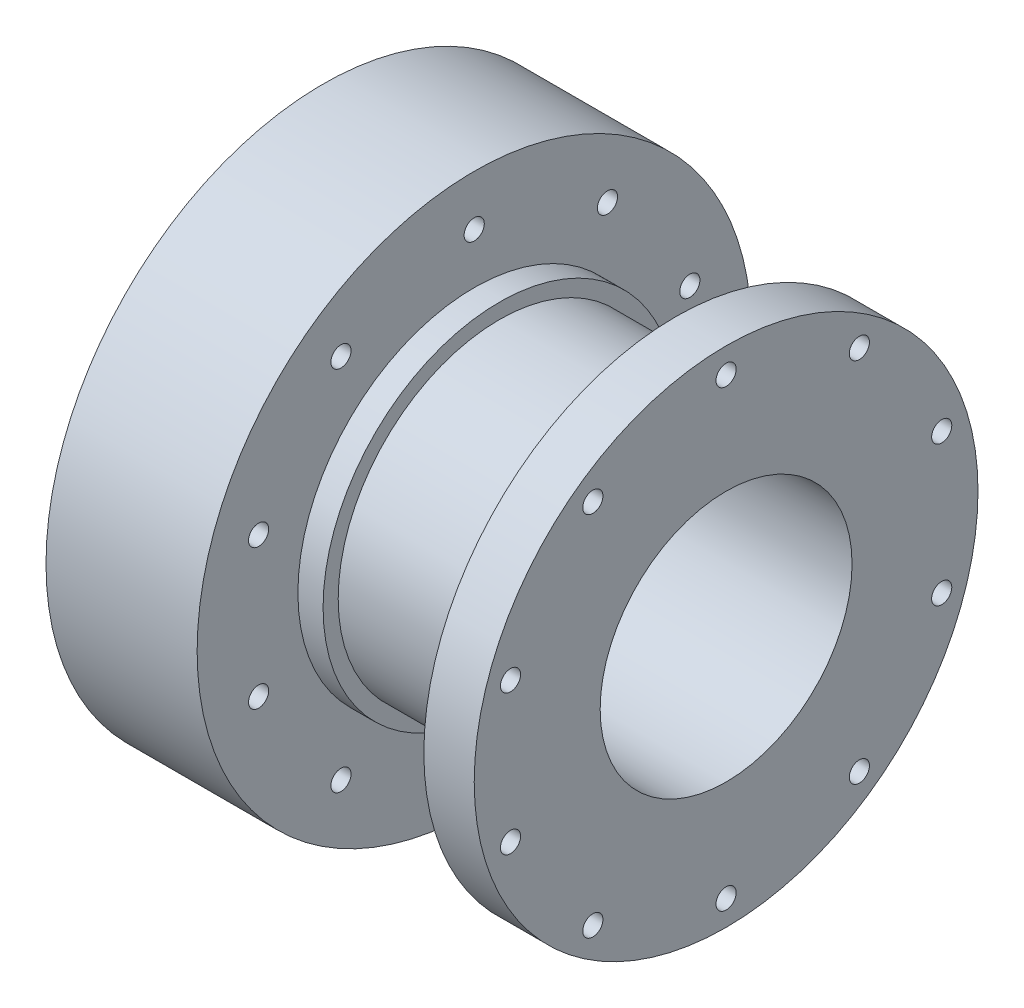
ISO-10303-21;
HEADER;
FILE_DESCRIPTION(('STEP AP214'),'2;1');
FILE_NAME('part.step','',(''),(''),'','','');
FILE_SCHEMA(('AUTOMOTIVE_DESIGN { 1 0 10303 214 1 1 1 1 }'));
ENDSEC;
DATA;
#1=APPLICATION_CONTEXT('core data for automotive mechanical design processes');
#2=APPLICATION_PROTOCOL_DEFINITION('international standard','automotive_design',2000,#1);
#3=PRODUCT_CONTEXT('',#1,'mechanical');
#4=PRODUCT('Part','Part','',(#3));
#5=PRODUCT_RELATED_PRODUCT_CATEGORY('part','',(#4));
#6=PRODUCT_DEFINITION_FORMATION('','',#4);
#7=PRODUCT_DEFINITION_CONTEXT('part definition',#1,'design');
#8=PRODUCT_DEFINITION('design','',#6,#7);
#9=PRODUCT_DEFINITION_SHAPE('','',#8);
#10=(LENGTH_UNIT() NAMED_UNIT(*) SI_UNIT(.MILLI.,.METRE.));
#11=(NAMED_UNIT(*) PLANE_ANGLE_UNIT() SI_UNIT($,.RADIAN.));
#12=(NAMED_UNIT(*) SI_UNIT($,.STERADIAN.) SOLID_ANGLE_UNIT());
#13=UNCERTAINTY_MEASURE_WITH_UNIT(LENGTH_MEASURE(1.E-05),#10,'distance_accuracy_value','');
#14=(GEOMETRIC_REPRESENTATION_CONTEXT(3) GLOBAL_UNCERTAINTY_ASSIGNED_CONTEXT((#13)) GLOBAL_UNIT_ASSIGNED_CONTEXT((#10,
#11,#12)) REPRESENTATION_CONTEXT('',''));
#15=CARTESIAN_POINT('',(0.,0.,0.));
#16=DIRECTION('',(0.,0.,1.));
#17=DIRECTION('',(1.,0.,0.));
#18=AXIS2_PLACEMENT_3D('',#15,#16,#17);
#19=CARTESIAN_POINT('',(-41.8890273651995,0.,0.));
#20=DIRECTION('',(-1.,0.,0.));
#21=DIRECTION('',(0.,0.,1.));
#22=AXIS2_PLACEMENT_3D('',#19,#20,#21);
#23=CYLINDRICAL_SURFACE('',#22,25.);
#24=CARTESIAN_POINT('',(72.6128260491978,0.,0.));
#25=DIRECTION('',(-1.,0.,0.));
#26=DIRECTION('',(0.,0.,1.));
#27=AXIS2_PLACEMENT_3D('',#24,#25,#26);
#28=CIRCLE('',#27,25.);
#29=CARTESIAN_POINT('',(72.6128260491978,0.,25.));
#30=VERTEX_POINT('',#29);
#31=EDGE_CURVE('E10',#30,#30,#28,.T.);
#32=ORIENTED_EDGE('',*,*,#31,.F.);
#33=EDGE_LOOP('',(#32));
#34=FACE_BOUND('',#33,.T.);
#35=CARTESIAN_POINT('',(12.6128260491978,0.,0.));
#36=DIRECTION('',(-1.,0.,0.));
#37=DIRECTION('',(0.,0.,1.));
#38=AXIS2_PLACEMENT_3D('',#35,#36,#37);
#39=CIRCLE('',#38,25.);
#40=CARTESIAN_POINT('',(12.6128260491978,0.,25.));
#41=VERTEX_POINT('',#40);
#42=EDGE_CURVE('E137',#41,#41,#39,.T.);
#43=ORIENTED_EDGE('',*,*,#42,.T.);
#44=EDGE_LOOP('',(#43));
#45=FACE_BOUND('',#44,.T.);
#46=ADVANCED_FACE('F40',(#34,#45),#23,.F.);
#47=CARTESIAN_POINT('',(72.6128260491978,25.,0.));
#48=DIRECTION('',(-1.,0.,0.));
#49=DIRECTION('',(0.,0.,1.));
#50=AXIS2_PLACEMENT_3D('',#47,#48,#49);
#51=PLANE('',#50);
#52=CARTESIAN_POINT('',(72.6128260491978,45.,0.));
#53=DIRECTION('',(1.,0.,0.));
#54=DIRECTION('',(0.,0.,-1.));
#55=AXIS2_PLACEMENT_3D('',#52,#53,#54);
#56=CIRCLE('',#55,2.);
#57=CARTESIAN_POINT('',(72.6128260491978,45.,-2.));
#58=VERTEX_POINT('',#57);
#59=EDGE_CURVE('E63',#58,#58,#56,.T.);
#60=ORIENTED_EDGE('',*,*,#59,.F.);
#61=EDGE_LOOP('',(#60));
#62=FACE_BOUND('',#61,.T.);
#63=CARTESIAN_POINT('',(72.6128260491978,36.405764746873,26.4503363531608));
#64=DIRECTION('',(1.,0.,0.));
#65=DIRECTION('',(0.,0.,-1.));
#66=AXIS2_PLACEMENT_3D('',#63,#64,#65);
#67=CIRCLE('',#66,2.);
#68=CARTESIAN_POINT('',(72.6128260491978,36.405764746873,24.4503363531608));
#69=VERTEX_POINT('',#68);
#70=EDGE_CURVE('E443',#69,#69,#67,.T.);
#71=ORIENTED_EDGE('',*,*,#70,.F.);
#72=EDGE_LOOP('',(#71));
#73=FACE_BOUND('',#72,.T.);
#74=CARTESIAN_POINT('',(72.6128260491978,13.9057647468731,42.7975432332818));
#75=DIRECTION('',(1.,0.,0.));
#76=DIRECTION('',(0.,0.,-1.));
#77=AXIS2_PLACEMENT_3D('',#74,#75,#76);
#78=CIRCLE('',#77,2.);
#79=CARTESIAN_POINT('',(72.6128260491978,13.9057647468731,40.7975432332818));
#80=VERTEX_POINT('',#79);
#81=EDGE_CURVE('E388',#80,#80,#78,.T.);
#82=ORIENTED_EDGE('',*,*,#81,.F.);
#83=EDGE_LOOP('',(#82));
#84=FACE_BOUND('',#83,.T.);
#85=CARTESIAN_POINT('',(72.6128260491978,-13.9057647468722,42.797543233282));
#86=DIRECTION('',(1.,0.,0.));
#87=DIRECTION('',(0.,0.,-1.));
#88=AXIS2_PLACEMENT_3D('',#85,#86,#87);
#89=CIRCLE('',#88,2.);
#90=CARTESIAN_POINT('',(72.6128260491978,-13.9057647468722,40.797543233282));
#91=VERTEX_POINT('',#90);
#92=EDGE_CURVE('E442',#91,#91,#89,.T.);
#93=ORIENTED_EDGE('',*,*,#92,.F.);
#94=EDGE_LOOP('',(#93));
#95=FACE_BOUND('',#94,.T.);
#96=CARTESIAN_POINT('',(72.6128260491978,-36.4057647468724,26.4503363531616));
#97=DIRECTION('',(1.,0.,0.));
#98=DIRECTION('',(0.,0.,-1.));
#99=AXIS2_PLACEMENT_3D('',#96,#97,#98);
#100=CIRCLE('',#99,2.);
#101=CARTESIAN_POINT('',(72.6128260491978,-36.4057647468724,24.4503363531616));
#102=VERTEX_POINT('',#101);
#103=EDGE_CURVE('E447',#102,#102,#100,.T.);
#104=ORIENTED_EDGE('',*,*,#103,.F.);
#105=EDGE_LOOP('',(#104));
#106=FACE_BOUND('',#105,.T.);
#107=CARTESIAN_POINT('',(72.6128260491978,-45.,3.14233320495882E-13));
#108=DIRECTION('',(1.,0.,0.));
#109=DIRECTION('',(0.,0.,-1.));
#110=AXIS2_PLACEMENT_3D('',#107,#108,#109);
#111=CIRCLE('',#110,2.);
#112=CARTESIAN_POINT('',(72.6128260491978,-45.,-1.99999999999969));
#113=VERTEX_POINT('',#112);
#114=EDGE_CURVE('E451',#113,#113,#111,.T.);
#115=ORIENTED_EDGE('',*,*,#114,.F.);
#116=EDGE_LOOP('',(#115));
#117=FACE_BOUND('',#116,.T.);
#118=CARTESIAN_POINT('',(72.6128260491978,-36.4057647468728,-26.4503363531611));
#119=DIRECTION('',(1.,0.,0.));
#120=DIRECTION('',(0.,0.,-1.));
#121=AXIS2_PLACEMENT_3D('',#118,#119,#120);
#122=CIRCLE('',#121,2.);
#123=CARTESIAN_POINT('',(72.6128260491978,-36.4057647468728,-28.4503363531611));
#124=VERTEX_POINT('',#123);
#125=EDGE_CURVE('E455',#124,#124,#122,.T.);
#126=ORIENTED_EDGE('',*,*,#125,.F.);
#127=EDGE_LOOP('',(#126));
#128=FACE_BOUND('',#127,.T.);
#129=CARTESIAN_POINT('',(72.6128260491978,-13.9057647468728,-42.7975432332819));
#130=DIRECTION('',(1.,0.,0.));
#131=DIRECTION('',(0.,0.,-1.));
#132=AXIS2_PLACEMENT_3D('',#129,#130,#131);
#133=CIRCLE('',#132,2.);
#134=CARTESIAN_POINT('',(72.6128260491978,-13.9057647468728,-44.7975432332819));
#135=VERTEX_POINT('',#134);
#136=EDGE_CURVE('E459',#135,#135,#133,.T.);
#137=ORIENTED_EDGE('',*,*,#136,.F.);
#138=EDGE_LOOP('',(#137));
#139=FACE_BOUND('',#138,.T.);
#140=CARTESIAN_POINT('',(72.6128260491978,13.9057647468725,-42.797543233282));
#141=DIRECTION('',(1.,0.,0.));
#142=DIRECTION('',(0.,0.,-1.));
#143=AXIS2_PLACEMENT_3D('',#140,#141,#142);
#144=CIRCLE('',#143,2.);
#145=CARTESIAN_POINT('',(72.6128260491978,13.9057647468725,-44.797543233282));
#146=VERTEX_POINT('',#145);
#147=EDGE_CURVE('E463',#146,#146,#144,.T.);
#148=ORIENTED_EDGE('',*,*,#147,.F.);
#149=EDGE_LOOP('',(#148));
#150=FACE_BOUND('',#149,.T.);
#151=CARTESIAN_POINT('',(72.6128260491978,36.4057647468726,-26.4503363531613));
#152=DIRECTION('',(1.,0.,0.));
#153=DIRECTION('',(0.,0.,-1.));
#154=AXIS2_PLACEMENT_3D('',#151,#152,#153);
#155=CIRCLE('',#154,2.);
#156=CARTESIAN_POINT('',(72.6128260491978,36.4057647468726,-28.4503363531613));
#157=VERTEX_POINT('',#156);
#158=EDGE_CURVE('E467',#157,#157,#155,.T.);
#159=ORIENTED_EDGE('',*,*,#158,.F.);
#160=EDGE_LOOP('',(#159));
#161=FACE_BOUND('',#160,.T.);
#162=CARTESIAN_POINT('',(72.6128260491978,0.,0.));
#163=DIRECTION('',(-1.,0.,0.));
#164=DIRECTION('',(0.,0.,1.));
#165=AXIS2_PLACEMENT_3D('',#162,#163,#164);
#166=CIRCLE('',#165,50.);
#167=CARTESIAN_POINT('',(72.6128260491978,0.,50.));
#168=VERTEX_POINT('',#167);
#169=EDGE_CURVE('E48',#168,#168,#166,.T.);
#170=ORIENTED_EDGE('',*,*,#169,.F.);
#171=EDGE_LOOP('',(#170));
#172=FACE_BOUND('',#171,.T.);
#173=ORIENTED_EDGE('',*,*,#31,.T.);
#174=EDGE_LOOP('',(#173));
#175=FACE_BOUND('',#174,.T.);
#176=ADVANCED_FACE('F205',(#62,#73,#84,#95,#106,#117,#128,#139,#150,#161,#172,#175),#51,.F.);
#177=CARTESIAN_POINT('',(-41.8890273651995,0.,0.));
#178=DIRECTION('',(-1.,0.,0.));
#179=DIRECTION('',(0.,0.,1.));
#180=AXIS2_PLACEMENT_3D('',#177,#178,#179);
#181=CYLINDRICAL_SURFACE('',#180,50.);
#182=CARTESIAN_POINT('',(62.6128260491978,0.,0.));
#183=DIRECTION('',(-1.,0.,0.));
#184=DIRECTION('',(0.,0.,1.));
#185=AXIS2_PLACEMENT_3D('',#182,#183,#184);
#186=CIRCLE('',#185,50.);
#187=CARTESIAN_POINT('',(62.6128260491978,0.,50.));
#188=VERTEX_POINT('',#187);
#189=EDGE_CURVE('E54',#188,#188,#186,.T.);
#190=ORIENTED_EDGE('',*,*,#189,.F.);
#191=EDGE_LOOP('',(#190));
#192=FACE_BOUND('',#191,.T.);
#193=ORIENTED_EDGE('',*,*,#169,.T.);
#194=EDGE_LOOP('',(#193));
#195=FACE_BOUND('',#194,.T.);
#196=ADVANCED_FACE('F202',(#192,#195),#181,.T.);
#197=CARTESIAN_POINT('',(62.6128260491978,50.,0.));
#198=DIRECTION('',(1.,0.,0.));
#199=DIRECTION('',(0.,0.,-1.));
#200=AXIS2_PLACEMENT_3D('',#197,#198,#199);
#201=PLANE('',#200);
#202=CARTESIAN_POINT('',(62.6128260491978,45.,0.));
#203=DIRECTION('',(1.,0.,0.));
#204=DIRECTION('',(0.,0.,-1.));
#205=AXIS2_PLACEMENT_3D('',#202,#203,#204);
#206=CIRCLE('',#205,2.);
#207=CARTESIAN_POINT('',(62.6128260491978,45.,-2.));
#208=VERTEX_POINT('',#207);
#209=EDGE_CURVE('E133',#208,#208,#206,.T.);
#210=ORIENTED_EDGE('',*,*,#209,.T.);
#211=EDGE_LOOP('',(#210));
#212=FACE_BOUND('',#211,.T.);
#213=CARTESIAN_POINT('',(62.6128260491978,36.405764746873,26.4503363531608));
#214=DIRECTION('',(1.,0.,0.));
#215=DIRECTION('',(0.,0.,-1.));
#216=AXIS2_PLACEMENT_3D('',#213,#214,#215);
#217=CIRCLE('',#216,2.);
#218=CARTESIAN_POINT('',(62.6128260491978,36.405764746873,24.4503363531608));
#219=VERTEX_POINT('',#218);
#220=EDGE_CURVE('E115',#219,#219,#217,.T.);
#221=ORIENTED_EDGE('',*,*,#220,.T.);
#222=EDGE_LOOP('',(#221));
#223=FACE_BOUND('',#222,.T.);
#224=CARTESIAN_POINT('',(62.6128260491978,13.9057647468731,42.7975432332818));
#225=DIRECTION('',(1.,0.,0.));
#226=DIRECTION('',(0.,0.,-1.));
#227=AXIS2_PLACEMENT_3D('',#224,#225,#226);
#228=CIRCLE('',#227,2.);
#229=CARTESIAN_POINT('',(62.6128260491978,13.9057647468731,40.7975432332818));
#230=VERTEX_POINT('',#229);
#231=EDGE_CURVE('E109',#230,#230,#228,.T.);
#232=ORIENTED_EDGE('',*,*,#231,.T.);
#233=EDGE_LOOP('',(#232));
#234=FACE_BOUND('',#233,.T.);
#235=CARTESIAN_POINT('',(62.6128260491978,-13.9057647468722,42.797543233282));
#236=DIRECTION('',(1.,0.,0.));
#237=DIRECTION('',(0.,0.,-1.));
#238=AXIS2_PLACEMENT_3D('',#235,#236,#237);
#239=CIRCLE('',#238,2.);
#240=CARTESIAN_POINT('',(62.6128260491978,-13.9057647468722,40.797543233282));
#241=VERTEX_POINT('',#240);
#242=EDGE_CURVE('E104',#241,#241,#239,.T.);
#243=ORIENTED_EDGE('',*,*,#242,.T.);
#244=EDGE_LOOP('',(#243));
#245=FACE_BOUND('',#244,.T.);
#246=CARTESIAN_POINT('',(62.6128260491978,-36.4057647468724,26.4503363531616));
#247=DIRECTION('',(1.,0.,0.));
#248=DIRECTION('',(0.,0.,-1.));
#249=AXIS2_PLACEMENT_3D('',#246,#247,#248);
#250=CIRCLE('',#249,2.);
#251=CARTESIAN_POINT('',(62.6128260491978,-36.4057647468724,24.4503363531616));
#252=VERTEX_POINT('',#251);
#253=EDGE_CURVE('E99',#252,#252,#250,.T.);
#254=ORIENTED_EDGE('',*,*,#253,.T.);
#255=EDGE_LOOP('',(#254));
#256=FACE_BOUND('',#255,.T.);
#257=CARTESIAN_POINT('',(62.6128260491978,-45.,3.14233320495882E-13));
#258=DIRECTION('',(1.,0.,0.));
#259=DIRECTION('',(0.,0.,-1.));
#260=AXIS2_PLACEMENT_3D('',#257,#258,#259);
#261=CIRCLE('',#260,2.);
#262=CARTESIAN_POINT('',(62.6128260491978,-45.,-1.99999999999969));
#263=VERTEX_POINT('',#262);
#264=EDGE_CURVE('E93',#263,#263,#261,.T.);
#265=ORIENTED_EDGE('',*,*,#264,.T.);
#266=EDGE_LOOP('',(#265));
#267=FACE_BOUND('',#266,.T.);
#268=CARTESIAN_POINT('',(62.6128260491978,-36.4057647468728,-26.4503363531611));
#269=DIRECTION('',(1.,0.,0.));
#270=DIRECTION('',(0.,0.,-1.));
#271=AXIS2_PLACEMENT_3D('',#268,#269,#270);
#272=CIRCLE('',#271,2.);
#273=CARTESIAN_POINT('',(62.6128260491978,-36.4057647468728,-28.4503363531611));
#274=VERTEX_POINT('',#273);
#275=EDGE_CURVE('E87',#274,#274,#272,.T.);
#276=ORIENTED_EDGE('',*,*,#275,.T.);
#277=EDGE_LOOP('',(#276));
#278=FACE_BOUND('',#277,.T.);
#279=CARTESIAN_POINT('',(62.6128260491978,-13.9057647468728,-42.7975432332819));
#280=DIRECTION('',(1.,0.,0.));
#281=DIRECTION('',(0.,0.,-1.));
#282=AXIS2_PLACEMENT_3D('',#279,#280,#281);
#283=CIRCLE('',#282,2.);
#284=CARTESIAN_POINT('',(62.6128260491978,-13.9057647468728,-44.7975432332819));
#285=VERTEX_POINT('',#284);
#286=EDGE_CURVE('E81',#285,#285,#283,.T.);
#287=ORIENTED_EDGE('',*,*,#286,.T.);
#288=EDGE_LOOP('',(#287));
#289=FACE_BOUND('',#288,.T.);
#290=CARTESIAN_POINT('',(62.6128260491978,13.9057647468725,-42.797543233282));
#291=DIRECTION('',(1.,0.,0.));
#292=DIRECTION('',(0.,0.,-1.));
#293=AXIS2_PLACEMENT_3D('',#290,#291,#292);
#294=CIRCLE('',#293,2.);
#295=CARTESIAN_POINT('',(62.6128260491978,13.9057647468725,-44.797543233282));
#296=VERTEX_POINT('',#295);
#297=EDGE_CURVE('E75',#296,#296,#294,.T.);
#298=ORIENTED_EDGE('',*,*,#297,.T.);
#299=EDGE_LOOP('',(#298));
#300=FACE_BOUND('',#299,.T.);
#301=CARTESIAN_POINT('',(62.6128260491978,36.4057647468726,-26.4503363531613));
#302=DIRECTION('',(1.,0.,0.));
#303=DIRECTION('',(0.,0.,-1.));
#304=AXIS2_PLACEMENT_3D('',#301,#302,#303);
#305=CIRCLE('',#304,2.);
#306=CARTESIAN_POINT('',(62.6128260491978,36.4057647468726,-28.4503363531613));
#307=VERTEX_POINT('',#306);
#308=EDGE_CURVE('E69',#307,#307,#305,.T.);
#309=ORIENTED_EDGE('',*,*,#308,.T.);
#310=EDGE_LOOP('',(#309));
#311=FACE_BOUND('',#310,.T.);
#312=CARTESIAN_POINT('',(62.6128260491978,0.,0.));
#313=DIRECTION('',(-1.,0.,0.));
#314=DIRECTION('',(0.,0.,1.));
#315=AXIS2_PLACEMENT_3D('',#312,#313,#314);
#316=CIRCLE('',#315,35.);
#317=CARTESIAN_POINT('',(62.6128260491978,0.,35.));
#318=VERTEX_POINT('',#317);
#319=EDGE_CURVE('E193',#318,#318,#316,.T.);
#320=ORIENTED_EDGE('',*,*,#319,.F.);
#321=EDGE_LOOP('',(#320));
#322=FACE_BOUND('',#321,.T.);
#323=ORIENTED_EDGE('',*,*,#189,.T.);
#324=EDGE_LOOP('',(#323));
#325=FACE_BOUND('',#324,.T.);
#326=ADVANCED_FACE('F200',(#212,#223,#234,#245,#256,#267,#278,#289,#300,#311,#322,#325),#201,.F.);
#327=CARTESIAN_POINT('',(-41.8890273651995,0.,0.));
#328=DIRECTION('',(-1.,0.,0.));
#329=DIRECTION('',(0.,0.,1.));
#330=AXIS2_PLACEMENT_3D('',#327,#328,#329);
#331=CYLINDRICAL_SURFACE('',#330,35.);
#332=CARTESIAN_POINT('',(57.6128260491978,0.,0.));
#333=DIRECTION('',(-1.,0.,0.));
#334=DIRECTION('',(0.,0.,1.));
#335=AXIS2_PLACEMENT_3D('',#332,#333,#334);
#336=CIRCLE('',#335,35.);
#337=CARTESIAN_POINT('',(57.6128260491978,0.,35.));
#338=VERTEX_POINT('',#337);
#339=EDGE_CURVE('E189',#338,#338,#336,.T.);
#340=ORIENTED_EDGE('',*,*,#339,.F.);
#341=EDGE_LOOP('',(#340));
#342=FACE_BOUND('',#341,.T.);
#343=ORIENTED_EDGE('',*,*,#319,.T.);
#344=EDGE_LOOP('',(#343));
#345=FACE_BOUND('',#344,.T.);
#346=ADVANCED_FACE('F220',(#342,#345),#331,.T.);
#347=CARTESIAN_POINT('',(57.6128260491978,35.,0.));
#348=DIRECTION('',(1.,0.,0.));
#349=DIRECTION('',(0.,0.,-1.));
#350=AXIS2_PLACEMENT_3D('',#347,#348,#349);
#351=PLANE('',#350);
#352=CARTESIAN_POINT('',(57.6128260491978,0.,0.));
#353=DIRECTION('',(-1.,0.,0.));
#354=DIRECTION('',(0.,0.,1.));
#355=AXIS2_PLACEMENT_3D('',#352,#353,#354);
#356=CIRCLE('',#355,32.);
#357=CARTESIAN_POINT('',(57.6128260491978,0.,32.));
#358=VERTEX_POINT('',#357);
#359=EDGE_CURVE('E185',#358,#358,#356,.T.);
#360=ORIENTED_EDGE('',*,*,#359,.F.);
#361=EDGE_LOOP('',(#360));
#362=FACE_BOUND('',#361,.T.);
#363=ORIENTED_EDGE('',*,*,#339,.T.);
#364=EDGE_LOOP('',(#363));
#365=FACE_BOUND('',#364,.T.);
#366=ADVANCED_FACE('F224',(#362,#365),#351,.F.);
#367=CARTESIAN_POINT('',(-41.8890273651995,0.,0.));
#368=DIRECTION('',(-1.,0.,0.));
#369=DIRECTION('',(0.,0.,1.));
#370=AXIS2_PLACEMENT_3D('',#367,#368,#369);
#371=CYLINDRICAL_SURFACE('',#370,32.);
#372=CARTESIAN_POINT('',(27.6128260491978,0.,0.));
#373=DIRECTION('',(-1.,0.,0.));
#374=DIRECTION('',(0.,0.,1.));
#375=AXIS2_PLACEMENT_3D('',#372,#373,#374);
#376=CIRCLE('',#375,32.);
#377=CARTESIAN_POINT('',(27.6128260491978,0.,32.));
#378=VERTEX_POINT('',#377);
#379=EDGE_CURVE('E181',#378,#378,#376,.T.);
#380=ORIENTED_EDGE('',*,*,#379,.F.);
#381=EDGE_LOOP('',(#380));
#382=FACE_BOUND('',#381,.T.);
#383=ORIENTED_EDGE('',*,*,#359,.T.);
#384=EDGE_LOOP('',(#383));
#385=FACE_BOUND('',#384,.T.);
#386=ADVANCED_FACE('F228',(#382,#385),#371,.T.);
#387=CARTESIAN_POINT('',(27.6128260491978,32.,0.));
#388=DIRECTION('',(-1.,0.,0.));
#389=DIRECTION('',(0.,0.,1.));
#390=AXIS2_PLACEMENT_3D('',#387,#388,#389);
#391=PLANE('',#390);
#392=CARTESIAN_POINT('',(27.6128260491978,0.,0.));
#393=DIRECTION('',(-1.,0.,0.));
#394=DIRECTION('',(0.,0.,1.));
#395=AXIS2_PLACEMENT_3D('',#392,#393,#394);
#396=CIRCLE('',#395,35.);
#397=CARTESIAN_POINT('',(27.6128260491978,0.,35.));
#398=VERTEX_POINT('',#397);
#399=EDGE_CURVE('E177',#398,#398,#396,.T.);
#400=ORIENTED_EDGE('',*,*,#399,.F.);
#401=EDGE_LOOP('',(#400));
#402=FACE_BOUND('',#401,.T.);
#403=ORIENTED_EDGE('',*,*,#379,.T.);
#404=EDGE_LOOP('',(#403));
#405=FACE_BOUND('',#404,.T.);
#406=ADVANCED_FACE('F232',(#402,#405),#391,.F.);
#407=CARTESIAN_POINT('',(-41.8890273651995,0.,0.));
#408=DIRECTION('',(-1.,0.,0.));
#409=DIRECTION('',(0.,0.,1.));
#410=AXIS2_PLACEMENT_3D('',#407,#408,#409);
#411=CYLINDRICAL_SURFACE('',#410,35.);
#412=CARTESIAN_POINT('',(22.6128260491978,0.,0.));
#413=DIRECTION('',(-1.,0.,0.));
#414=DIRECTION('',(0.,0.,1.));
#415=AXIS2_PLACEMENT_3D('',#412,#413,#414);
#416=CIRCLE('',#415,35.);
#417=CARTESIAN_POINT('',(22.6128260491978,0.,35.));
#418=VERTEX_POINT('',#417);
#419=EDGE_CURVE('E173',#418,#418,#416,.T.);
#420=ORIENTED_EDGE('',*,*,#419,.F.);
#421=EDGE_LOOP('',(#420));
#422=FACE_BOUND('',#421,.T.);
#423=ORIENTED_EDGE('',*,*,#399,.T.);
#424=EDGE_LOOP('',(#423));
#425=FACE_BOUND('',#424,.T.);
#426=ADVANCED_FACE('F236',(#422,#425),#411,.T.);
#427=CARTESIAN_POINT('',(22.6128260491978,35.,0.));
#428=DIRECTION('',(-1.,0.,0.));
#429=DIRECTION('',(0.,0.,1.));
#430=AXIS2_PLACEMENT_3D('',#427,#428,#429);
#431=PLANE('',#430);
#432=CARTESIAN_POINT('',(22.6128260491978,45.,0.));
#433=DIRECTION('',(-1.,0.,0.));
#434=DIRECTION('',(0.,0.,1.));
#435=AXIS2_PLACEMENT_3D('',#432,#433,#434);
#436=CIRCLE('',#435,2.);
#437=CARTESIAN_POINT('',(22.6128260491978,45.,2.));
#438=VERTEX_POINT('',#437);
#439=EDGE_CURVE('E129',#438,#438,#436,.T.);
#440=ORIENTED_EDGE('',*,*,#439,.T.);
#441=EDGE_LOOP('',(#440));
#442=FACE_BOUND('',#441,.T.);
#443=CARTESIAN_POINT('',(22.6128260491978,36.405764746873,26.4503363531608));
#444=DIRECTION('',(-1.,0.,0.));
#445=DIRECTION('',(0.,0.,1.));
#446=AXIS2_PLACEMENT_3D('',#443,#444,#445);
#447=CIRCLE('',#446,2.);
#448=CARTESIAN_POINT('',(22.6128260491978,36.405764746873,28.4503363531608));
#449=VERTEX_POINT('',#448);
#450=EDGE_CURVE('E108',#449,#449,#447,.T.);
#451=ORIENTED_EDGE('',*,*,#450,.T.);
#452=EDGE_LOOP('',(#451));
#453=FACE_BOUND('',#452,.T.);
#454=CARTESIAN_POINT('',(22.6128260491978,13.9057647468731,42.7975432332818));
#455=DIRECTION('',(-1.,0.,0.));
#456=DIRECTION('',(0.,0.,1.));
#457=AXIS2_PLACEMENT_3D('',#454,#455,#456);
#458=CIRCLE('',#457,2.);
#459=CARTESIAN_POINT('',(22.6128260491978,13.9057647468731,44.7975432332818));
#460=VERTEX_POINT('',#459);
#461=EDGE_CURVE('E103',#460,#460,#458,.T.);
#462=ORIENTED_EDGE('',*,*,#461,.T.);
#463=EDGE_LOOP('',(#462));
#464=FACE_BOUND('',#463,.T.);
#465=CARTESIAN_POINT('',(22.6128260491978,-13.9057647468722,42.797543233282));
#466=DIRECTION('',(-1.,0.,0.));
#467=DIRECTION('',(0.,0.,1.));
#468=AXIS2_PLACEMENT_3D('',#465,#466,#467);
#469=CIRCLE('',#468,2.);
#470=CARTESIAN_POINT('',(22.6128260491978,-13.9057647468722,44.797543233282));
#471=VERTEX_POINT('',#470);
#472=EDGE_CURVE('E98',#471,#471,#469,.T.);
#473=ORIENTED_EDGE('',*,*,#472,.T.);
#474=EDGE_LOOP('',(#473));
#475=FACE_BOUND('',#474,.T.);
#476=CARTESIAN_POINT('',(22.6128260491978,-36.4057647468724,26.4503363531616));
#477=DIRECTION('',(-1.,0.,0.));
#478=DIRECTION('',(0.,0.,1.));
#479=AXIS2_PLACEMENT_3D('',#476,#477,#478);
#480=CIRCLE('',#479,2.);
#481=CARTESIAN_POINT('',(22.6128260491978,-36.4057647468724,28.4503363531616));
#482=VERTEX_POINT('',#481);
#483=EDGE_CURVE('E92',#482,#482,#480,.T.);
#484=ORIENTED_EDGE('',*,*,#483,.T.);
#485=EDGE_LOOP('',(#484));
#486=FACE_BOUND('',#485,.T.);
#487=CARTESIAN_POINT('',(22.6128260491978,-45.,3.14233320495882E-13));
#488=DIRECTION('',(-1.,0.,0.));
#489=DIRECTION('',(0.,0.,1.));
#490=AXIS2_PLACEMENT_3D('',#487,#488,#489);
#491=CIRCLE('',#490,2.);
#492=CARTESIAN_POINT('',(22.6128260491978,-45.,2.00000000000031));
#493=VERTEX_POINT('',#492);
#494=EDGE_CURVE('E86',#493,#493,#491,.T.);
#495=ORIENTED_EDGE('',*,*,#494,.T.);
#496=EDGE_LOOP('',(#495));
#497=FACE_BOUND('',#496,.T.);
#498=CARTESIAN_POINT('',(22.6128260491978,-36.4057647468728,-26.4503363531611));
#499=DIRECTION('',(-1.,0.,0.));
#500=DIRECTION('',(0.,0.,1.));
#501=AXIS2_PLACEMENT_3D('',#498,#499,#500);
#502=CIRCLE('',#501,2.);
#503=CARTESIAN_POINT('',(22.6128260491978,-36.4057647468728,-24.4503363531611));
#504=VERTEX_POINT('',#503);
#505=EDGE_CURVE('E80',#504,#504,#502,.T.);
#506=ORIENTED_EDGE('',*,*,#505,.T.);
#507=EDGE_LOOP('',(#506));
#508=FACE_BOUND('',#507,.T.);
#509=CARTESIAN_POINT('',(22.6128260491978,-13.9057647468728,-42.7975432332819));
#510=DIRECTION('',(-1.,0.,0.));
#511=DIRECTION('',(0.,0.,1.));
#512=AXIS2_PLACEMENT_3D('',#509,#510,#511);
#513=CIRCLE('',#512,2.);
#514=CARTESIAN_POINT('',(22.6128260491978,-13.9057647468728,-40.7975432332819));
#515=VERTEX_POINT('',#514);
#516=EDGE_CURVE('E74',#515,#515,#513,.T.);
#517=ORIENTED_EDGE('',*,*,#516,.T.);
#518=EDGE_LOOP('',(#517));
#519=FACE_BOUND('',#518,.T.);
#520=CARTESIAN_POINT('',(22.6128260491978,13.9057647468725,-42.797543233282));
#521=DIRECTION('',(-1.,0.,0.));
#522=DIRECTION('',(0.,0.,1.));
#523=AXIS2_PLACEMENT_3D('',#520,#521,#522);
#524=CIRCLE('',#523,2.);
#525=CARTESIAN_POINT('',(22.6128260491978,13.9057647468725,-40.797543233282));
#526=VERTEX_POINT('',#525);
#527=EDGE_CURVE('E68',#526,#526,#524,.T.);
#528=ORIENTED_EDGE('',*,*,#527,.T.);
#529=EDGE_LOOP('',(#528));
#530=FACE_BOUND('',#529,.T.);
#531=CARTESIAN_POINT('',(22.6128260491978,36.4057647468726,-26.4503363531613));
#532=DIRECTION('',(-1.,0.,0.));
#533=DIRECTION('',(0.,0.,1.));
#534=AXIS2_PLACEMENT_3D('',#531,#532,#533);
#535=CIRCLE('',#534,2.);
#536=CARTESIAN_POINT('',(22.6128260491978,36.4057647468726,-24.4503363531613));
#537=VERTEX_POINT('',#536);
#538=EDGE_CURVE('E62',#537,#537,#535,.T.);
#539=ORIENTED_EDGE('',*,*,#538,.T.);
#540=EDGE_LOOP('',(#539));
#541=FACE_BOUND('',#540,.T.);
#542=CARTESIAN_POINT('',(22.6128260491978,0.,0.));
#543=DIRECTION('',(-1.,0.,0.));
#544=DIRECTION('',(0.,0.,1.));
#545=AXIS2_PLACEMENT_3D('',#542,#543,#544);
#546=CIRCLE('',#545,55.);
#547=CARTESIAN_POINT('',(22.6128260491978,0.,55.));
#548=VERTEX_POINT('',#547);
#549=EDGE_CURVE('E169',#548,#548,#546,.T.);
#550=ORIENTED_EDGE('',*,*,#549,.F.);
#551=EDGE_LOOP('',(#550));
#552=FACE_BOUND('',#551,.T.);
#553=ORIENTED_EDGE('',*,*,#419,.T.);
#554=EDGE_LOOP('',(#553));
#555=FACE_BOUND('',#554,.T.);
#556=ADVANCED_FACE('F240',(#442,#453,#464,#475,#486,#497,#508,#519,#530,#541,#552,#555),#431,.F.);
#557=CARTESIAN_POINT('',(-41.8890273651995,0.,0.));
#558=DIRECTION('',(-1.,0.,0.));
#559=DIRECTION('',(0.,0.,1.));
#560=AXIS2_PLACEMENT_3D('',#557,#558,#559);
#561=CYLINDRICAL_SURFACE('',#560,55.);
#562=CARTESIAN_POINT('',(-7.38717395080218,0.,0.));
#563=DIRECTION('',(-1.,0.,0.));
#564=DIRECTION('',(0.,0.,1.));
#565=AXIS2_PLACEMENT_3D('',#562,#563,#564);
#566=CIRCLE('',#565,55.);
#567=CARTESIAN_POINT('',(-7.38717395080218,0.,55.));
#568=VERTEX_POINT('',#567);
#569=EDGE_CURVE('E165',#568,#568,#566,.T.);
#570=ORIENTED_EDGE('',*,*,#569,.F.);
#571=EDGE_LOOP('',(#570));
#572=FACE_BOUND('',#571,.T.);
#573=ORIENTED_EDGE('',*,*,#549,.T.);
#574=EDGE_LOOP('',(#573));
#575=FACE_BOUND('',#574,.T.);
#576=ADVANCED_FACE('F244',(#572,#575),#561,.T.);
#577=CARTESIAN_POINT('',(-7.38717395080218,55.,0.));
#578=DIRECTION('',(1.,0.,0.));
#579=DIRECTION('',(0.,0.,-1.));
#580=AXIS2_PLACEMENT_3D('',#577,#578,#579);
#581=PLANE('',#580);
#582=CARTESIAN_POINT('',(-7.38717395080218,0.,0.));
#583=DIRECTION('',(-1.,0.,0.));
#584=DIRECTION('',(0.,0.,1.));
#585=AXIS2_PLACEMENT_3D('',#582,#583,#584);
#586=CIRCLE('',#585,50.);
#587=CARTESIAN_POINT('',(-7.38717395080218,0.,50.));
#588=VERTEX_POINT('',#587);
#589=EDGE_CURVE('E161',#588,#588,#586,.T.);
#590=ORIENTED_EDGE('',*,*,#589,.F.);
#591=EDGE_LOOP('',(#590));
#592=FACE_BOUND('',#591,.T.);
#593=ORIENTED_EDGE('',*,*,#569,.T.);
#594=EDGE_LOOP('',(#593));
#595=FACE_BOUND('',#594,.T.);
#596=ADVANCED_FACE('F248',(#592,#595),#581,.F.);
#597=CARTESIAN_POINT('',(-41.8890273651995,0.,0.));
#598=DIRECTION('',(-1.,0.,0.));
#599=DIRECTION('',(0.,0.,1.));
#600=AXIS2_PLACEMENT_3D('',#597,#598,#599);
#601=CYLINDRICAL_SURFACE('',#600,50.);
#602=CARTESIAN_POINT('',(12.6128260491978,0.,0.));
#603=DIRECTION('',(-1.,0.,0.));
#604=DIRECTION('',(0.,0.,1.));
#605=AXIS2_PLACEMENT_3D('',#602,#603,#604);
#606=CIRCLE('',#605,50.);
#607=CARTESIAN_POINT('',(12.6128260491978,0.,50.));
#608=VERTEX_POINT('',#607);
#609=EDGE_CURVE('E157',#608,#608,#606,.T.);
#610=ORIENTED_EDGE('',*,*,#609,.F.);
#611=EDGE_LOOP('',(#610));
#612=FACE_BOUND('',#611,.T.);
#613=ORIENTED_EDGE('',*,*,#589,.T.);
#614=EDGE_LOOP('',(#613));
#615=FACE_BOUND('',#614,.T.);
#616=ADVANCED_FACE('F252',(#612,#615),#601,.F.);
#617=CARTESIAN_POINT('',(12.6128260491978,50.,0.));
#618=DIRECTION('',(1.,0.,0.));
#619=DIRECTION('',(0.,0.,-1.));
#620=AXIS2_PLACEMENT_3D('',#617,#618,#619);
#621=PLANE('',#620);
#622=CARTESIAN_POINT('',(12.6128260491978,45.,0.));
#623=DIRECTION('',(1.,0.,0.));
#624=DIRECTION('',(0.,0.,-1.));
#625=AXIS2_PLACEMENT_3D('',#622,#623,#624);
#626=CIRCLE('',#625,2.);
#627=CARTESIAN_POINT('',(12.6128260491978,45.,-2.));
#628=VERTEX_POINT('',#627);
#629=EDGE_CURVE('E43',#628,#628,#626,.T.);
#630=ORIENTED_EDGE('',*,*,#629,.T.);
#631=EDGE_LOOP('',(#630));
#632=FACE_BOUND('',#631,.T.);
#633=CARTESIAN_POINT('',(12.6128260491978,36.405764746873,26.4503363531608));
#634=DIRECTION('',(1.,0.,0.));
#635=DIRECTION('',(0.,0.,-1.));
#636=AXIS2_PLACEMENT_3D('',#633,#634,#635);
#637=CIRCLE('',#636,2.);
#638=CARTESIAN_POINT('',(12.6128260491978,36.405764746873,24.4503363531608));
#639=VERTEX_POINT('',#638);
#640=EDGE_CURVE('E105',#639,#639,#637,.T.);
#641=ORIENTED_EDGE('',*,*,#640,.T.);
#642=EDGE_LOOP('',(#641));
#643=FACE_BOUND('',#642,.T.);
#644=CARTESIAN_POINT('',(12.6128260491978,13.9057647468731,42.7975432332818));
#645=DIRECTION('',(1.,0.,0.));
#646=DIRECTION('',(0.,0.,-1.));
#647=AXIS2_PLACEMENT_3D('',#644,#645,#646);
#648=CIRCLE('',#647,2.);
#649=CARTESIAN_POINT('',(12.6128260491978,13.9057647468731,40.7975432332818));
#650=VERTEX_POINT('',#649);
#651=EDGE_CURVE('E100',#650,#650,#648,.T.);
#652=ORIENTED_EDGE('',*,*,#651,.T.);
#653=EDGE_LOOP('',(#652));
#654=FACE_BOUND('',#653,.T.);
#655=CARTESIAN_POINT('',(12.6128260491978,-13.9057647468722,42.797543233282));
#656=DIRECTION('',(1.,0.,0.));
#657=DIRECTION('',(0.,0.,-1.));
#658=AXIS2_PLACEMENT_3D('',#655,#656,#657);
#659=CIRCLE('',#658,2.);
#660=CARTESIAN_POINT('',(12.6128260491978,-13.9057647468722,40.797543233282));
#661=VERTEX_POINT('',#660);
#662=EDGE_CURVE('E94',#661,#661,#659,.T.);
#663=ORIENTED_EDGE('',*,*,#662,.T.);
#664=EDGE_LOOP('',(#663));
#665=FACE_BOUND('',#664,.T.);
#666=CARTESIAN_POINT('',(12.6128260491978,-36.4057647468724,26.4503363531616));
#667=DIRECTION('',(1.,0.,0.));
#668=DIRECTION('',(0.,0.,-1.));
#669=AXIS2_PLACEMENT_3D('',#666,#667,#668);
#670=CIRCLE('',#669,2.);
#671=CARTESIAN_POINT('',(12.6128260491978,-36.4057647468724,24.4503363531616));
#672=VERTEX_POINT('',#671);
#673=EDGE_CURVE('E88',#672,#672,#670,.T.);
#674=ORIENTED_EDGE('',*,*,#673,.T.);
#675=EDGE_LOOP('',(#674));
#676=FACE_BOUND('',#675,.T.);
#677=CARTESIAN_POINT('',(12.6128260491978,-45.,3.14233320495882E-13));
#678=DIRECTION('',(1.,0.,0.));
#679=DIRECTION('',(0.,0.,-1.));
#680=AXIS2_PLACEMENT_3D('',#677,#678,#679);
#681=CIRCLE('',#680,2.);
#682=CARTESIAN_POINT('',(12.6128260491978,-45.,-1.99999999999969));
#683=VERTEX_POINT('',#682);
#684=EDGE_CURVE('E82',#683,#683,#681,.T.);
#685=ORIENTED_EDGE('',*,*,#684,.T.);
#686=EDGE_LOOP('',(#685));
#687=FACE_BOUND('',#686,.T.);
#688=CARTESIAN_POINT('',(12.6128260491978,-36.4057647468728,-26.4503363531611));
#689=DIRECTION('',(1.,0.,0.));
#690=DIRECTION('',(0.,0.,-1.));
#691=AXIS2_PLACEMENT_3D('',#688,#689,#690);
#692=CIRCLE('',#691,2.);
#693=CARTESIAN_POINT('',(12.6128260491978,-36.4057647468728,-28.4503363531611));
#694=VERTEX_POINT('',#693);
#695=EDGE_CURVE('E76',#694,#694,#692,.T.);
#696=ORIENTED_EDGE('',*,*,#695,.T.);
#697=EDGE_LOOP('',(#696));
#698=FACE_BOUND('',#697,.T.);
#699=CARTESIAN_POINT('',(12.6128260491978,-13.9057647468728,-42.7975432332819));
#700=DIRECTION('',(1.,0.,0.));
#701=DIRECTION('',(0.,0.,-1.));
#702=AXIS2_PLACEMENT_3D('',#699,#700,#701);
#703=CIRCLE('',#702,2.);
#704=CARTESIAN_POINT('',(12.6128260491978,-13.9057647468728,-44.7975432332819));
#705=VERTEX_POINT('',#704);
#706=EDGE_CURVE('E70',#705,#705,#703,.T.);
#707=ORIENTED_EDGE('',*,*,#706,.T.);
#708=EDGE_LOOP('',(#707));
#709=FACE_BOUND('',#708,.T.);
#710=CARTESIAN_POINT('',(12.6128260491978,13.9057647468725,-42.797543233282));
#711=DIRECTION('',(1.,0.,0.));
#712=DIRECTION('',(0.,0.,-1.));
#713=AXIS2_PLACEMENT_3D('',#710,#711,#712);
#714=CIRCLE('',#713,2.);
#715=CARTESIAN_POINT('',(12.6128260491978,13.9057647468725,-44.797543233282));
#716=VERTEX_POINT('',#715);
#717=EDGE_CURVE('E64',#716,#716,#714,.T.);
#718=ORIENTED_EDGE('',*,*,#717,.T.);
#719=EDGE_LOOP('',(#718));
#720=FACE_BOUND('',#719,.T.);
#721=CARTESIAN_POINT('',(12.6128260491978,36.4057647468726,-26.4503363531613));
#722=DIRECTION('',(1.,0.,0.));
#723=DIRECTION('',(0.,0.,-1.));
#724=AXIS2_PLACEMENT_3D('',#721,#722,#723);
#725=CIRCLE('',#724,2.);
#726=CARTESIAN_POINT('',(12.6128260491978,36.4057647468726,-28.4503363531613));
#727=VERTEX_POINT('',#726);
#728=EDGE_CURVE('E58',#727,#727,#725,.T.);
#729=ORIENTED_EDGE('',*,*,#728,.T.);
#730=EDGE_LOOP('',(#729));
#731=FACE_BOUND('',#730,.T.);
#732=CARTESIAN_POINT('',(12.6128260491978,0.,0.));
#733=DIRECTION('',(-1.,0.,0.));
#734=DIRECTION('',(0.,0.,1.));
#735=AXIS2_PLACEMENT_3D('',#732,#733,#734);
#736=CIRCLE('',#735,40.);
#737=CARTESIAN_POINT('',(12.6128260491978,0.,40.));
#738=VERTEX_POINT('',#737);
#739=EDGE_CURVE('E153',#738,#738,#736,.T.);
#740=ORIENTED_EDGE('',*,*,#739,.F.);
#741=EDGE_LOOP('',(#740));
#742=FACE_BOUND('',#741,.T.);
#743=ORIENTED_EDGE('',*,*,#609,.T.);
#744=EDGE_LOOP('',(#743));
#745=FACE_BOUND('',#744,.T.);
#746=ADVANCED_FACE('F256',(#632,#643,#654,#665,#676,#687,#698,#709,#720,#731,#742,#745),#621,.F.);
#747=CARTESIAN_POINT('',(-41.8890273651995,0.,0.));
#748=DIRECTION('',(-1.,0.,0.));
#749=DIRECTION('',(0.,0.,1.));
#750=AXIS2_PLACEMENT_3D('',#747,#748,#749);
#751=CYLINDRICAL_SURFACE('',#750,40.);
#752=CARTESIAN_POINT('',(-7.38717395080217,0.,0.));
#753=DIRECTION('',(-1.,0.,0.));
#754=DIRECTION('',(0.,0.,1.));
#755=AXIS2_PLACEMENT_3D('',#752,#753,#754);
#756=CIRCLE('',#755,40.);
#757=CARTESIAN_POINT('',(-7.38717395080217,0.,40.));
#758=VERTEX_POINT('',#757);
#759=EDGE_CURVE('E149',#758,#758,#756,.T.);
#760=ORIENTED_EDGE('',*,*,#759,.F.);
#761=EDGE_LOOP('',(#760));
#762=FACE_BOUND('',#761,.T.);
#763=ORIENTED_EDGE('',*,*,#739,.T.);
#764=EDGE_LOOP('',(#763));
#765=FACE_BOUND('',#764,.T.);
#766=ADVANCED_FACE('F260',(#762,#765),#751,.T.);
#767=CARTESIAN_POINT('',(-7.38717395080217,40.,0.));
#768=DIRECTION('',(1.,0.,0.));
#769=DIRECTION('',(0.,0.,-1.));
#770=AXIS2_PLACEMENT_3D('',#767,#768,#769);
#771=PLANE('',#770);
#772=CARTESIAN_POINT('',(-7.38717395080217,0.,0.));
#773=DIRECTION('',(-1.,0.,0.));
#774=DIRECTION('',(0.,0.,1.));
#775=AXIS2_PLACEMENT_3D('',#772,#773,#774);
#776=CIRCLE('',#775,35.);
#777=CARTESIAN_POINT('',(-7.38717395080217,0.,35.));
#778=VERTEX_POINT('',#777);
#779=EDGE_CURVE('E145',#778,#778,#776,.T.);
#780=ORIENTED_EDGE('',*,*,#779,.F.);
#781=EDGE_LOOP('',(#780));
#782=FACE_BOUND('',#781,.T.);
#783=ORIENTED_EDGE('',*,*,#759,.T.);
#784=EDGE_LOOP('',(#783));
#785=FACE_BOUND('',#784,.T.);
#786=ADVANCED_FACE('F264',(#782,#785),#771,.F.);
#787=CARTESIAN_POINT('',(-41.8890273651995,0.,0.));
#788=DIRECTION('',(-1.,0.,0.));
#789=DIRECTION('',(0.,0.,1.));
#790=AXIS2_PLACEMENT_3D('',#787,#788,#789);
#791=CYLINDRICAL_SURFACE('',#790,35.);
#792=CARTESIAN_POINT('',(12.6128260491978,0.,0.));
#793=DIRECTION('',(-1.,0.,0.));
#794=DIRECTION('',(0.,0.,1.));
#795=AXIS2_PLACEMENT_3D('',#792,#793,#794);
#796=CIRCLE('',#795,35.);
#797=CARTESIAN_POINT('',(12.6128260491978,0.,35.));
#798=VERTEX_POINT('',#797);
#799=EDGE_CURVE('E141',#798,#798,#796,.T.);
#800=ORIENTED_EDGE('',*,*,#799,.F.);
#801=EDGE_LOOP('',(#800));
#802=FACE_BOUND('',#801,.T.);
#803=ORIENTED_EDGE('',*,*,#779,.T.);
#804=EDGE_LOOP('',(#803));
#805=FACE_BOUND('',#804,.T.);
#806=ADVANCED_FACE('F268',(#802,#805),#791,.F.);
#807=CARTESIAN_POINT('',(12.6128260491978,35.,0.));
#808=DIRECTION('',(1.,0.,0.));
#809=DIRECTION('',(0.,0.,-1.));
#810=AXIS2_PLACEMENT_3D('',#807,#808,#809);
#811=PLANE('',#810);
#812=ORIENTED_EDGE('',*,*,#42,.F.);
#813=EDGE_LOOP('',(#812));
#814=FACE_BOUND('',#813,.T.);
#815=ORIENTED_EDGE('',*,*,#799,.T.);
#816=EDGE_LOOP('',(#815));
#817=FACE_BOUND('',#816,.T.);
#818=ADVANCED_FACE('F272',(#814,#817),#811,.F.);
#819=CARTESIAN_POINT('',(-7.38717395080218,36.4057647468726,-26.4503363531613));
#820=DIRECTION('',(1.,0.,0.));
#821=DIRECTION('',(0.,0.,-1.));
#822=AXIS2_PLACEMENT_3D('',#819,#820,#821);
#823=CYLINDRICAL_SURFACE('',#822,2.);
#824=ORIENTED_EDGE('',*,*,#728,.F.);
#825=EDGE_LOOP('',(#824));
#826=FACE_BOUND('',#825,.T.);
#827=ORIENTED_EDGE('',*,*,#538,.F.);
#828=EDGE_LOOP('',(#827));
#829=FACE_BOUND('',#828,.T.);
#830=ADVANCED_FACE('F276',(#826,#829),#823,.F.);
#831=CARTESIAN_POINT('',(-7.38717395080218,13.9057647468725,-42.797543233282));
#832=DIRECTION('',(1.,0.,0.));
#833=DIRECTION('',(0.,0.,-1.));
#834=AXIS2_PLACEMENT_3D('',#831,#832,#833);
#835=CYLINDRICAL_SURFACE('',#834,2.);
#836=ORIENTED_EDGE('',*,*,#717,.F.);
#837=EDGE_LOOP('',(#836));
#838=FACE_BOUND('',#837,.T.);
#839=ORIENTED_EDGE('',*,*,#527,.F.);
#840=EDGE_LOOP('',(#839));
#841=FACE_BOUND('',#840,.T.);
#842=ADVANCED_FACE('F314',(#838,#841),#835,.F.);
#843=CARTESIAN_POINT('',(-7.38717395080218,-13.9057647468728,-42.7975432332819));
#844=DIRECTION('',(1.,0.,0.));
#845=DIRECTION('',(0.,0.,-1.));
#846=AXIS2_PLACEMENT_3D('',#843,#844,#845);
#847=CYLINDRICAL_SURFACE('',#846,2.);
#848=ORIENTED_EDGE('',*,*,#706,.F.);
#849=EDGE_LOOP('',(#848));
#850=FACE_BOUND('',#849,.T.);
#851=ORIENTED_EDGE('',*,*,#516,.F.);
#852=EDGE_LOOP('',(#851));
#853=FACE_BOUND('',#852,.T.);
#854=ADVANCED_FACE('F309',(#850,#853),#847,.F.);
#855=CARTESIAN_POINT('',(-7.38717395080218,-36.4057647468728,-26.4503363531611));
#856=DIRECTION('',(1.,0.,0.));
#857=DIRECTION('',(0.,0.,-1.));
#858=AXIS2_PLACEMENT_3D('',#855,#856,#857);
#859=CYLINDRICAL_SURFACE('',#858,2.);
#860=ORIENTED_EDGE('',*,*,#695,.F.);
#861=EDGE_LOOP('',(#860));
#862=FACE_BOUND('',#861,.T.);
#863=ORIENTED_EDGE('',*,*,#505,.F.);
#864=EDGE_LOOP('',(#863));
#865=FACE_BOUND('',#864,.T.);
#866=ADVANCED_FACE('F304',(#862,#865),#859,.F.);
#867=CARTESIAN_POINT('',(-7.38717395080218,-45.,3.14233320495882E-13));
#868=DIRECTION('',(1.,0.,0.));
#869=DIRECTION('',(0.,0.,-1.));
#870=AXIS2_PLACEMENT_3D('',#867,#868,#869);
#871=CYLINDRICAL_SURFACE('',#870,2.);
#872=ORIENTED_EDGE('',*,*,#684,.F.);
#873=EDGE_LOOP('',(#872));
#874=FACE_BOUND('',#873,.T.);
#875=ORIENTED_EDGE('',*,*,#494,.F.);
#876=EDGE_LOOP('',(#875));
#877=FACE_BOUND('',#876,.T.);
#878=ADVANCED_FACE('F299',(#874,#877),#871,.F.);
#879=CARTESIAN_POINT('',(-7.38717395080218,-36.4057647468724,26.4503363531616));
#880=DIRECTION('',(1.,0.,0.));
#881=DIRECTION('',(0.,0.,-1.));
#882=AXIS2_PLACEMENT_3D('',#879,#880,#881);
#883=CYLINDRICAL_SURFACE('',#882,2.);
#884=ORIENTED_EDGE('',*,*,#673,.F.);
#885=EDGE_LOOP('',(#884));
#886=FACE_BOUND('',#885,.T.);
#887=ORIENTED_EDGE('',*,*,#483,.F.);
#888=EDGE_LOOP('',(#887));
#889=FACE_BOUND('',#888,.T.);
#890=ADVANCED_FACE('F294',(#886,#889),#883,.F.);
#891=CARTESIAN_POINT('',(-7.38717395080218,-13.9057647468722,42.797543233282));
#892=DIRECTION('',(1.,0.,0.));
#893=DIRECTION('',(0.,0.,-1.));
#894=AXIS2_PLACEMENT_3D('',#891,#892,#893);
#895=CYLINDRICAL_SURFACE('',#894,2.);
#896=ORIENTED_EDGE('',*,*,#662,.F.);
#897=EDGE_LOOP('',(#896));
#898=FACE_BOUND('',#897,.T.);
#899=ORIENTED_EDGE('',*,*,#472,.F.);
#900=EDGE_LOOP('',(#899));
#901=FACE_BOUND('',#900,.T.);
#902=ADVANCED_FACE('F289',(#898,#901),#895,.F.);
#903=CARTESIAN_POINT('',(-7.38717395080218,13.9057647468731,42.7975432332818));
#904=DIRECTION('',(1.,0.,0.));
#905=DIRECTION('',(0.,0.,-1.));
#906=AXIS2_PLACEMENT_3D('',#903,#904,#905);
#907=CYLINDRICAL_SURFACE('',#906,2.);
#908=ORIENTED_EDGE('',*,*,#651,.F.);
#909=EDGE_LOOP('',(#908));
#910=FACE_BOUND('',#909,.T.);
#911=ORIENTED_EDGE('',*,*,#461,.F.);
#912=EDGE_LOOP('',(#911));
#913=FACE_BOUND('',#912,.T.);
#914=ADVANCED_FACE('F284',(#910,#913),#907,.F.);
#915=CARTESIAN_POINT('',(-7.38717395080218,36.405764746873,26.4503363531608));
#916=DIRECTION('',(1.,0.,0.));
#917=DIRECTION('',(0.,0.,-1.));
#918=AXIS2_PLACEMENT_3D('',#915,#916,#917);
#919=CYLINDRICAL_SURFACE('',#918,2.);
#920=ORIENTED_EDGE('',*,*,#640,.F.);
#921=EDGE_LOOP('',(#920));
#922=FACE_BOUND('',#921,.T.);
#923=ORIENTED_EDGE('',*,*,#450,.F.);
#924=EDGE_LOOP('',(#923));
#925=FACE_BOUND('',#924,.T.);
#926=ADVANCED_FACE('F323',(#922,#925),#919,.F.);
#927=CARTESIAN_POINT('',(-7.38717395080218,45.,0.));
#928=DIRECTION('',(1.,0.,0.));
#929=DIRECTION('',(0.,0.,-1.));
#930=AXIS2_PLACEMENT_3D('',#927,#928,#929);
#931=CYLINDRICAL_SURFACE('',#930,2.);
#932=ORIENTED_EDGE('',*,*,#629,.F.);
#933=EDGE_LOOP('',(#932));
#934=FACE_BOUND('',#933,.T.);
#935=ORIENTED_EDGE('',*,*,#439,.F.);
#936=EDGE_LOOP('',(#935));
#937=FACE_BOUND('',#936,.T.);
#938=ADVANCED_FACE('F317',(#934,#937),#931,.F.);
#939=ORIENTED_EDGE('',*,*,#158,.T.);
#940=EDGE_LOOP('',(#939));
#941=FACE_BOUND('',#940,.T.);
#942=ORIENTED_EDGE('',*,*,#308,.F.);
#943=EDGE_LOOP('',(#942));
#944=FACE_BOUND('',#943,.T.);
#945=ADVANCED_FACE('F312',(#941,#944),#823,.F.);
#946=ORIENTED_EDGE('',*,*,#147,.T.);
#947=EDGE_LOOP('',(#946));
#948=FACE_BOUND('',#947,.T.);
#949=ORIENTED_EDGE('',*,*,#297,.F.);
#950=EDGE_LOOP('',(#949));
#951=FACE_BOUND('',#950,.T.);
#952=ADVANCED_FACE('F307',(#948,#951),#835,.F.);
#953=ORIENTED_EDGE('',*,*,#136,.T.);
#954=EDGE_LOOP('',(#953));
#955=FACE_BOUND('',#954,.T.);
#956=ORIENTED_EDGE('',*,*,#286,.F.);
#957=EDGE_LOOP('',(#956));
#958=FACE_BOUND('',#957,.T.);
#959=ADVANCED_FACE('F302',(#955,#958),#847,.F.);
#960=ORIENTED_EDGE('',*,*,#125,.T.);
#961=EDGE_LOOP('',(#960));
#962=FACE_BOUND('',#961,.T.);
#963=ORIENTED_EDGE('',*,*,#275,.F.);
#964=EDGE_LOOP('',(#963));
#965=FACE_BOUND('',#964,.T.);
#966=ADVANCED_FACE('F297',(#962,#965),#859,.F.);
#967=ORIENTED_EDGE('',*,*,#114,.T.);
#968=EDGE_LOOP('',(#967));
#969=FACE_BOUND('',#968,.T.);
#970=ORIENTED_EDGE('',*,*,#264,.F.);
#971=EDGE_LOOP('',(#970));
#972=FACE_BOUND('',#971,.T.);
#973=ADVANCED_FACE('F292',(#969,#972),#871,.F.);
#974=ORIENTED_EDGE('',*,*,#103,.T.);
#975=EDGE_LOOP('',(#974));
#976=FACE_BOUND('',#975,.T.);
#977=ORIENTED_EDGE('',*,*,#253,.F.);
#978=EDGE_LOOP('',(#977));
#979=FACE_BOUND('',#978,.T.);
#980=ADVANCED_FACE('F287',(#976,#979),#883,.F.);
#981=ORIENTED_EDGE('',*,*,#92,.T.);
#982=EDGE_LOOP('',(#981));
#983=FACE_BOUND('',#982,.T.);
#984=ORIENTED_EDGE('',*,*,#242,.F.);
#985=EDGE_LOOP('',(#984));
#986=FACE_BOUND('',#985,.T.);
#987=ADVANCED_FACE('F282',(#983,#986),#895,.F.);
#988=ORIENTED_EDGE('',*,*,#81,.T.);
#989=EDGE_LOOP('',(#988));
#990=FACE_BOUND('',#989,.T.);
#991=ORIENTED_EDGE('',*,*,#231,.F.);
#992=EDGE_LOOP('',(#991));
#993=FACE_BOUND('',#992,.T.);
#994=ADVANCED_FACE('F278',(#990,#993),#907,.F.);
#995=ORIENTED_EDGE('',*,*,#70,.T.);
#996=EDGE_LOOP('',(#995));
#997=FACE_BOUND('',#996,.T.);
#998=ORIENTED_EDGE('',*,*,#220,.F.);
#999=EDGE_LOOP('',(#998));
#1000=FACE_BOUND('',#999,.T.);
#1001=ADVANCED_FACE('F281',(#997,#1000),#919,.F.);
#1002=ORIENTED_EDGE('',*,*,#59,.T.);
#1003=EDGE_LOOP('',(#1002));
#1004=FACE_BOUND('',#1003,.T.);
#1005=ORIENTED_EDGE('',*,*,#209,.F.);
#1006=EDGE_LOOP('',(#1005));
#1007=FACE_BOUND('',#1006,.T.);
#1008=ADVANCED_FACE('F321',(#1004,#1007),#931,.F.);
#1009=CLOSED_SHELL('',(#46,#176,#196,#326,#346,#366,#386,#406,#426,#556,#576,#596,#616,#746,
#766,#786,#806,#818,#830,#842,#854,#866,#878,#890,#902,#914,#926,#938,#945,#952,#959,#966,#973,
#980,#987,#994,#1001,#1008));
#1010=MANIFOLD_SOLID_BREP('B2',#1009);
#1011=ADVANCED_BREP_SHAPE_REPRESENTATION('',(#18,#1010),#14);
#1012=SHAPE_DEFINITION_REPRESENTATION(#9,#1011);
ENDSEC;
END-ISO-10303-21;
